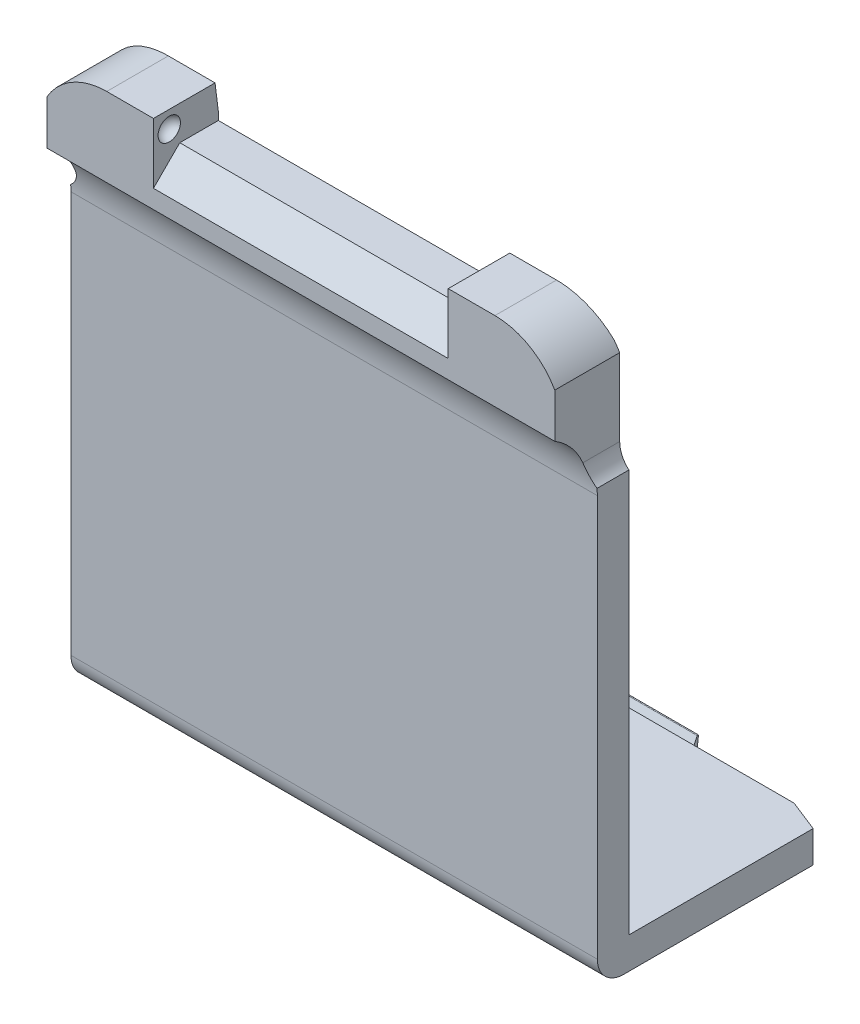
ISO-10303-21;
HEADER;
FILE_DESCRIPTION(('STEP AP214'),'2;1');
FILE_NAME('part.step','',(''),(''),'','','');
FILE_SCHEMA(('AUTOMOTIVE_DESIGN { 1 0 10303 214 1 1 1 1 }'));
ENDSEC;
DATA;
#1=APPLICATION_CONTEXT('core data for automotive mechanical design processes');
#2=APPLICATION_PROTOCOL_DEFINITION('international standard','automotive_design',2000,#1);
#3=PRODUCT_CONTEXT('',#1,'mechanical');
#4=PRODUCT('Part','Part','',(#3));
#5=PRODUCT_RELATED_PRODUCT_CATEGORY('part','',(#4));
#6=PRODUCT_DEFINITION_FORMATION('','',#4);
#7=PRODUCT_DEFINITION_CONTEXT('part definition',#1,'design');
#8=PRODUCT_DEFINITION('design','',#6,#7);
#9=PRODUCT_DEFINITION_SHAPE('','',#8);
#10=(LENGTH_UNIT() NAMED_UNIT(*) SI_UNIT(.MILLI.,.METRE.));
#11=(NAMED_UNIT(*) PLANE_ANGLE_UNIT() SI_UNIT($,.RADIAN.));
#12=(NAMED_UNIT(*) SI_UNIT($,.STERADIAN.) SOLID_ANGLE_UNIT());
#13=UNCERTAINTY_MEASURE_WITH_UNIT(LENGTH_MEASURE(1.E-05),#10,'distance_accuracy_value','');
#14=(GEOMETRIC_REPRESENTATION_CONTEXT(3) GLOBAL_UNCERTAINTY_ASSIGNED_CONTEXT((#13)) GLOBAL_UNIT_ASSIGNED_CONTEXT((#10,
#11,#12)) REPRESENTATION_CONTEXT('',''));
#15=CARTESIAN_POINT('',(0.,0.,0.));
#16=DIRECTION('',(0.,0.,1.));
#17=DIRECTION('',(1.,0.,0.));
#18=AXIS2_PLACEMENT_3D('',#15,#16,#17);
#19=CARTESIAN_POINT('',(0.,0.,-14.95));
#20=DIRECTION('',(0.,0.,1.));
#21=DIRECTION('',(1.,0.,0.));
#22=AXIS2_PLACEMENT_3D('',#19,#20,#21);
#23=PLANE('',#22);
#24=DIRECTION('',(0.,1.,0.));
#25=VECTOR('',#24,1.);
#26=CARTESIAN_POINT('',(10.,-2.4,-14.95));
#27=LINE('',#26,#25);
#28=CARTESIAN_POINT('',(10.,-2.4,-14.95));
#29=VERTEX_POINT('',#28);
#30=CARTESIAN_POINT('',(10.,0.,-14.95));
#31=VERTEX_POINT('',#30);
#32=EDGE_CURVE('E428',#29,#31,#27,.T.);
#33=ORIENTED_EDGE('',*,*,#32,.F.);
#34=DIRECTION('',(1.,0.,0.));
#35=VECTOR('',#34,1.);
#36=CARTESIAN_POINT('',(0.,-2.4,-14.95));
#37=LINE('',#36,#35);
#38=CARTESIAN_POINT('',(0.,-2.4,-14.95));
#39=VERTEX_POINT('',#38);
#40=EDGE_CURVE('E340',#39,#29,#37,.T.);
#41=ORIENTED_EDGE('',*,*,#40,.F.);
#42=DIRECTION('',(0.,-1.,0.));
#43=VECTOR('',#42,1.);
#44=CARTESIAN_POINT('',(0.,0.,-14.95));
#45=LINE('',#44,#43);
#46=CARTESIAN_POINT('',(0.,0.,-14.95));
#47=VERTEX_POINT('',#46);
#48=EDGE_CURVE('E351',#47,#39,#45,.T.);
#49=ORIENTED_EDGE('',*,*,#48,.F.);
#50=DIRECTION('',(-1.,0.,0.));
#51=VECTOR('',#50,1.);
#52=CARTESIAN_POINT('',(0.,0.,-14.95));
#53=LINE('',#52,#51);
#54=EDGE_CURVE('E335',#31,#47,#53,.T.);
#55=ORIENTED_EDGE('',*,*,#54,.F.);
#56=EDGE_LOOP('',(#33,#41,#49,#55));
#57=FACE_BOUND('',#56,.T.);
#58=ADVANCED_FACE('F35',(#57),#23,.F.);
#59=CARTESIAN_POINT('',(0.,40.6,2.4));
#60=DIRECTION('',(0.,-1.,0.));
#61=DIRECTION('',(0.,0.,-1.));
#62=AXIS2_PLACEMENT_3D('',#59,#60,#61);
#63=PLANE('',#62);
#64=DIRECTION('',(1.,0.,0.));
#65=VECTOR('',#64,1.);
#66=CARTESIAN_POINT('',(-7.60000000000001,40.6,0.25));
#67=LINE('',#66,#65);
#68=CARTESIAN_POINT('',(5.24999999999998,40.6,0.25));
#69=VERTEX_POINT('',#68);
#70=CARTESIAN_POINT('',(8.79999999999998,40.6,0.25));
#71=VERTEX_POINT('',#70);
#72=EDGE_CURVE('E380',#69,#71,#67,.T.);
#73=ORIENTED_EDGE('',*,*,#72,.F.);
#74=DIRECTION('',(0.,0.,-1.));
#75=VECTOR('',#74,1.);
#76=CARTESIAN_POINT('',(5.24999999999999,40.6,2.4));
#77=LINE('',#76,#75);
#78=CARTESIAN_POINT('',(5.24999999999999,40.6,4.93));
#79=VERTEX_POINT('',#78);
#80=EDGE_CURVE('E278',#69,#79,#77,.F.);
#81=ORIENTED_EDGE('',*,*,#80,.T.);
#82=DIRECTION('',(-1.,0.,0.));
#83=VECTOR('',#82,1.);
#84=CARTESIAN_POINT('',(0.,40.6,4.93));
#85=LINE('',#84,#83);
#86=CARTESIAN_POINT('',(8.79999999999999,40.6,4.93));
#87=VERTEX_POINT('',#86);
#88=EDGE_CURVE('E400',#87,#79,#85,.T.);
#89=ORIENTED_EDGE('',*,*,#88,.F.);
#90=DIRECTION('',(0.,0.,1.));
#91=VECTOR('',#90,1.);
#92=CARTESIAN_POINT('',(8.79999999999999,40.6,-22.5503880232691));
#93=LINE('',#92,#91);
#94=EDGE_CURVE('E410',#71,#87,#93,.T.);
#95=ORIENTED_EDGE('',*,*,#94,.F.);
#96=EDGE_LOOP('',(#73,#81,#89,#95));
#97=FACE_BOUND('',#96,.T.);
#98=ADVANCED_FACE('F462',(#97),#63,.F.);
#99=CARTESIAN_POINT('',(0.,0.,0.));
#100=DIRECTION('',(0.,0.,-1.));
#101=DIRECTION('',(-1.,0.,0.));
#102=AXIS2_PLACEMENT_3D('',#99,#100,#101);
#103=PLANE('',#102);
#104=DIRECTION('',(0.,-1.,0.));
#105=VECTOR('',#104,1.);
#106=CARTESIAN_POINT('',(0.,0.,0.));
#107=LINE('',#106,#105);
#108=CARTESIAN_POINT('',(0.,30.6,0.));
#109=VERTEX_POINT('',#108);
#110=CARTESIAN_POINT('',(0.,0.,0.));
#111=VERTEX_POINT('',#110);
#112=EDGE_CURVE('E235',#109,#111,#107,.T.);
#113=ORIENTED_EDGE('',*,*,#112,.F.);
#114=CARTESIAN_POINT('',(-1.30000000000002,32.1198684153571,0.));
#115=DIRECTION('',(0.,0.,-1.));
#116=DIRECTION('',(-1.,0.,0.));
#117=AXIS2_PLACEMENT_3D('',#114,#115,#116);
#118=CIRCLE('',#117,2.);
#119=CARTESIAN_POINT('',(0.699999999999978,32.1198684153571,0.));
#120=VERTEX_POINT('',#119);
#121=EDGE_CURVE('E218',#109,#120,#118,.F.);
#122=ORIENTED_EDGE('',*,*,#121,.T.);
#123=DIRECTION('',(0.,-1.,0.));
#124=VECTOR('',#123,1.);
#125=CARTESIAN_POINT('',(0.699999999999978,30.6,0.));
#126=LINE('',#125,#124);
#127=CARTESIAN_POINT('',(0.699999999999978,37.9691601707417,0.));
#128=VERTEX_POINT('',#127);
#129=EDGE_CURVE('E600',#128,#120,#126,.T.);
#130=ORIENTED_EDGE('',*,*,#129,.F.);
#131=CARTESIAN_POINT('',(5.24999999999999,35.35,0.));
#132=DIRECTION('',(0.,0.,-1.));
#133=DIRECTION('',(-1.,0.,0.));
#134=AXIS2_PLACEMENT_3D('',#131,#132,#133);
#135=CIRCLE('',#134,5.25);
#136=CARTESIAN_POINT('',(1.12689437438231,38.6,0.));
#137=VERTEX_POINT('',#136);
#138=EDGE_CURVE('E275',#128,#137,#135,.T.);
#139=ORIENTED_EDGE('',*,*,#138,.T.);
#140=DIRECTION('',(1.,0.,0.));
#141=VECTOR('',#140,1.);
#142=CARTESIAN_POINT('',(-7.60000000000001,38.6,0.));
#143=LINE('',#142,#141);
#144=CARTESIAN_POINT('',(8.79999999999999,38.6,0.));
#145=VERTEX_POINT('',#144);
#146=EDGE_CURVE('E379',#137,#145,#143,.T.);
#147=ORIENTED_EDGE('',*,*,#146,.T.);
#148=DIRECTION('',(0.,-1.,0.));
#149=VECTOR('',#148,1.);
#150=CARTESIAN_POINT('',(8.79999999999999,40.6,0.));
#151=LINE('',#150,#149);
#152=CARTESIAN_POINT('',(8.79999999999999,38.,0.));
#153=VERTEX_POINT('',#152);
#154=EDGE_CURVE('E407',#145,#153,#151,.T.);
#155=ORIENTED_EDGE('',*,*,#154,.T.);
#156=DIRECTION('',(1.,0.,0.));
#157=VECTOR('',#156,1.);
#158=CARTESIAN_POINT('',(8.79999999999999,38.,0.));
#159=LINE('',#158,#157);
#160=CARTESIAN_POINT('',(31.2,38.,0.));
#161=VERTEX_POINT('',#160);
#162=EDGE_CURVE('E403',#153,#161,#159,.T.);
#163=ORIENTED_EDGE('',*,*,#162,.T.);
#164=DIRECTION('',(0.,1.,0.));
#165=VECTOR('',#164,1.);
#166=CARTESIAN_POINT('',(31.2,40.6,0.));
#167=LINE('',#166,#165);
#168=CARTESIAN_POINT('',(31.2,38.6,0.));
#169=VERTEX_POINT('',#168);
#170=EDGE_CURVE('E411',#161,#169,#167,.T.);
#171=ORIENTED_EDGE('',*,*,#170,.T.);
#172=DIRECTION('',(-1.,0.,0.));
#173=VECTOR('',#172,1.);
#174=CARTESIAN_POINT('',(47.6,38.6,0.));
#175=LINE('',#174,#173);
#176=CARTESIAN_POINT('',(38.8731056256177,38.6,0.));
#177=VERTEX_POINT('',#176);
#178=EDGE_CURVE('E271',#177,#169,#175,.T.);
#179=ORIENTED_EDGE('',*,*,#178,.F.);
#180=CARTESIAN_POINT('',(34.75,35.35,0.));
#181=DIRECTION('',(0.,0.,-1.));
#182=DIRECTION('',(-1.,0.,0.));
#183=AXIS2_PLACEMENT_3D('',#180,#181,#182);
#184=CIRCLE('',#183,5.25);
#185=CARTESIAN_POINT('',(39.3,37.9691601707418,0.));
#186=VERTEX_POINT('',#185);
#187=EDGE_CURVE('E272',#177,#186,#184,.T.);
#188=ORIENTED_EDGE('',*,*,#187,.T.);
#189=DIRECTION('',(0.,1.,0.));
#190=VECTOR('',#189,1.);
#191=CARTESIAN_POINT('',(39.3,30.6,0.));
#192=LINE('',#191,#190);
#193=CARTESIAN_POINT('',(39.3,32.1198684153571,0.));
#194=VERTEX_POINT('',#193);
#195=EDGE_CURVE('E587',#194,#186,#192,.T.);
#196=ORIENTED_EDGE('',*,*,#195,.F.);
#197=CARTESIAN_POINT('',(41.3,32.1198684153571,0.));
#198=DIRECTION('',(0.,0.,-1.));
#199=DIRECTION('',(-1.,0.,0.));
#200=AXIS2_PLACEMENT_3D('',#197,#198,#199);
#201=CIRCLE('',#200,2.);
#202=CARTESIAN_POINT('',(40.,30.6,0.));
#203=VERTEX_POINT('',#202);
#204=EDGE_CURVE('E48',#194,#203,#201,.F.);
#205=ORIENTED_EDGE('',*,*,#204,.T.);
#206=DIRECTION('',(0.,1.,0.));
#207=VECTOR('',#206,1.);
#208=CARTESIAN_POINT('',(40.,0.,0.));
#209=LINE('',#208,#207);
#210=CARTESIAN_POINT('',(40.,0.,0.));
#211=VERTEX_POINT('',#210);
#212=EDGE_CURVE('E250',#211,#203,#209,.T.);
#213=ORIENTED_EDGE('',*,*,#212,.F.);
#214=DIRECTION('',(1.,0.,0.));
#215=VECTOR('',#214,1.);
#216=CARTESIAN_POINT('',(0.,0.,0.));
#217=LINE('',#216,#215);
#218=EDGE_CURVE('E246',#111,#211,#217,.T.);
#219=ORIENTED_EDGE('',*,*,#218,.F.);
#220=EDGE_LOOP('',(#113,#122,#130,#139,#147,#155,#163,#171,#179,#188,#196,#205,#213,#219));
#221=FACE_BOUND('',#220,.T.);
#222=ADVANCED_FACE('F243',(#221),#103,.T.);
#223=CARTESIAN_POINT('',(8.79999999999999,40.6,-22.5503880232691));
#224=DIRECTION('',(-1.,0.,0.));
#225=DIRECTION('',(0.,-1.,0.));
#226=AXIS2_PLACEMENT_3D('',#223,#224,#225);
#227=PLANE('',#226);
#228=CARTESIAN_POINT('',(8.79999999999999,39.3,3.73));
#229=DIRECTION('',(-1.,0.,0.));
#230=DIRECTION('',(0.,-1.,0.));
#231=AXIS2_PLACEMENT_3D('',#228,#229,#230);
#232=CIRCLE('',#231,0.85);
#233=CARTESIAN_POINT('',(8.79999999999999,38.45,3.73));
#234=VERTEX_POINT('',#233);
#235=EDGE_CURVE('E264',#234,#234,#232,.F.);
#236=ORIENTED_EDGE('',*,*,#235,.F.);
#237=EDGE_LOOP('',(#236));
#238=FACE_BOUND('',#237,.T.);
#239=DIRECTION('',(0.,0.992277876713668,0.124034734589208));
#240=VECTOR('',#239,1.);
#241=CARTESIAN_POINT('',(8.79999999999999,38.6,0.));
#242=LINE('',#241,#240);
#243=EDGE_CURVE('E376',#145,#71,#242,.T.);
#244=ORIENTED_EDGE('',*,*,#243,.T.);
#245=ORIENTED_EDGE('',*,*,#94,.T.);
#246=DIRECTION('',(0.,1.,0.));
#247=VECTOR('',#246,1.);
#248=CARTESIAN_POINT('',(8.80000000000002,0.,4.93));
#249=LINE('',#248,#247);
#250=CARTESIAN_POINT('',(8.8,36.,4.93));
#251=VERTEX_POINT('',#250);
#252=EDGE_CURVE('E397',#251,#87,#249,.T.);
#253=ORIENTED_EDGE('',*,*,#252,.F.);
#254=DIRECTION('',(0.,0.707106781186546,-0.707106781186549));
#255=VECTOR('',#254,1.);
#256=CARTESIAN_POINT('',(8.79999999999998,52.0401940116346,-11.1101940116346));
#257=LINE('',#256,#255);
#258=CARTESIAN_POINT('',(8.79999999999999,38.,2.92999999999999));
#259=VERTEX_POINT('',#258);
#260=EDGE_CURVE('E481',#251,#259,#257,.T.);
#261=ORIENTED_EDGE('',*,*,#260,.T.);
#262=DIRECTION('',(0.,0.,1.));
#263=VECTOR('',#262,1.);
#264=CARTESIAN_POINT('',(8.79999999999999,38.,-22.5503880232691));
#265=LINE('',#264,#263);
#266=EDGE_CURVE('E409',#153,#259,#265,.T.);
#267=ORIENTED_EDGE('',*,*,#266,.F.);
#268=ORIENTED_EDGE('',*,*,#154,.F.);
#269=EDGE_LOOP('',(#244,#245,#253,#261,#267,#268));
#270=FACE_BOUND('',#269,.T.);
#271=ADVANCED_FACE('F465',(#238,#270),#227,.F.);
#272=CARTESIAN_POINT('',(5.24999999999999,35.35,2.4));
#273=DIRECTION('',(0.,0.,-1.));
#274=DIRECTION('',(-1.,0.,0.));
#275=AXIS2_PLACEMENT_3D('',#272,#273,#274);
#276=CYLINDRICAL_SURFACE('',#275,5.25);
#277=DIRECTION('',(0.,0.,-1.));
#278=VECTOR('',#277,1.);
#279=CARTESIAN_POINT('',(0.699999999999978,37.9691601707417,2.4));
#280=LINE('',#279,#278);
#281=CARTESIAN_POINT('',(0.699999999999978,37.9691601707417,4.93));
#282=VERTEX_POINT('',#281);
#283=EDGE_CURVE('E240',#282,#128,#280,.T.);
#284=ORIENTED_EDGE('',*,*,#283,.F.);
#285=CARTESIAN_POINT('',(5.24999999999999,35.35,4.93));
#286=DIRECTION('',(0.,0.,1.));
#287=DIRECTION('',(1.,0.,0.));
#288=AXIS2_PLACEMENT_3D('',#285,#286,#287);
#289=CIRCLE('',#288,5.25);
#290=EDGE_CURVE('E282',#79,#282,#289,.T.);
#291=ORIENTED_EDGE('',*,*,#290,.F.);
#292=ORIENTED_EDGE('',*,*,#80,.F.);
#293=CARTESIAN_POINT('',(5.24999999999999,35.35,-0.406249999999997));
#294=DIRECTION('',(0.,0.124034734589208,-0.992277876713668));
#295=DIRECTION('',(0.,-0.992277876713668,-0.124034734589208));
#296=AXIS2_PLACEMENT_3D('',#293,#294,#295);
#297=ELLIPSE('',#296,5.29085664732092,5.25);
#298=EDGE_CURVE('E305',#69,#137,#297,.F.);
#299=ORIENTED_EDGE('',*,*,#298,.T.);
#300=ORIENTED_EDGE('',*,*,#138,.F.);
#301=EDGE_LOOP('',(#284,#291,#292,#299,#300));
#302=FACE_BOUND('',#301,.T.);
#303=ADVANCED_FACE('F454',(#302),#276,.T.);
#304=CARTESIAN_POINT('',(0.,0.,2.4));
#305=DIRECTION('',(0.,0.,-1.));
#306=DIRECTION('',(-1.,0.,0.));
#307=AXIS2_PLACEMENT_3D('',#304,#305,#306);
#308=PLANE('',#307);
#309=DIRECTION('',(0.,-1.,0.));
#310=VECTOR('',#309,1.);
#311=CARTESIAN_POINT('',(0.,0.,2.4));
#312=LINE('',#311,#310);
#313=CARTESIAN_POINT('',(0.,30.1095545877942,2.4));
#314=VERTEX_POINT('',#313);
#315=CARTESIAN_POINT('',(0.,-0.4,2.4));
#316=VERTEX_POINT('',#315);
#317=EDGE_CURVE('E289',#314,#316,#312,.T.);
#318=ORIENTED_EDGE('',*,*,#317,.T.);
#319=DIRECTION('',(1.,0.,0.));
#320=VECTOR('',#319,1.);
#321=CARTESIAN_POINT('',(40.,-0.4,2.4));
#322=LINE('',#321,#320);
#323=CARTESIAN_POINT('',(40.,-0.4,2.4));
#324=VERTEX_POINT('',#323);
#325=EDGE_CURVE('E307',#316,#324,#322,.T.);
#326=ORIENTED_EDGE('',*,*,#325,.T.);
#327=DIRECTION('',(0.,1.,0.));
#328=VECTOR('',#327,1.);
#329=CARTESIAN_POINT('',(40.,0.,2.4));
#330=LINE('',#329,#328);
#331=CARTESIAN_POINT('',(40.,30.1095545877942,2.4));
#332=VERTEX_POINT('',#331);
#333=EDGE_CURVE('E276',#324,#332,#330,.T.);
#334=ORIENTED_EDGE('',*,*,#333,.T.);
#335=DIRECTION('',(1.,0.,0.));
#336=VECTOR('',#335,1.);
#337=CARTESIAN_POINT('',(0.,30.1095545877942,2.4));
#338=LINE('',#337,#336);
#339=EDGE_CURVE('E288',#332,#314,#338,.F.);
#340=ORIENTED_EDGE('',*,*,#339,.T.);
#341=EDGE_LOOP('',(#318,#326,#334,#340));
#342=FACE_BOUND('',#341,.T.);
#343=ADVANCED_FACE('F439',(#342),#308,.F.);
#344=DIRECTION('',(0.,0.,-1.));
#345=VECTOR('',#344,1.);
#346=CARTESIAN_POINT('',(34.75,40.6,2.4));
#347=LINE('',#346,#345);
#348=CARTESIAN_POINT('',(34.75,40.6,4.93));
#349=VERTEX_POINT('',#348);
#350=CARTESIAN_POINT('',(34.75,40.6,0.25));
#351=VERTEX_POINT('',#350);
#352=EDGE_CURVE('E285',#349,#351,#347,.T.);
#353=ORIENTED_EDGE('',*,*,#352,.T.);
#354=DIRECTION('',(-1.,0.,0.));
#355=VECTOR('',#354,1.);
#356=CARTESIAN_POINT('',(47.6,40.6,0.25));
#357=LINE('',#356,#355);
#358=CARTESIAN_POINT('',(31.2,40.6,0.25));
#359=VERTEX_POINT('',#358);
#360=EDGE_CURVE('E386',#351,#359,#357,.T.);
#361=ORIENTED_EDGE('',*,*,#360,.T.);
#362=DIRECTION('',(0.,0.,1.));
#363=VECTOR('',#362,1.);
#364=CARTESIAN_POINT('',(31.2,40.6,-22.5503880232691));
#365=LINE('',#364,#363);
#366=CARTESIAN_POINT('',(31.2,40.6,4.93));
#367=VERTEX_POINT('',#366);
#368=EDGE_CURVE('E414',#359,#367,#365,.T.);
#369=ORIENTED_EDGE('',*,*,#368,.T.);
#370=DIRECTION('',(-1.,0.,0.));
#371=VECTOR('',#370,1.);
#372=CARTESIAN_POINT('',(0.,40.6,4.93));
#373=LINE('',#372,#371);
#374=EDGE_CURVE('E392',#349,#367,#373,.T.);
#375=ORIENTED_EDGE('',*,*,#374,.F.);
#376=EDGE_LOOP('',(#353,#361,#369,#375));
#377=FACE_BOUND('',#376,.T.);
#378=ADVANCED_FACE('F535',(#377),#63,.F.);
#379=CARTESIAN_POINT('',(0.,0.,2.4));
#380=DIRECTION('',(1.,0.,0.));
#381=DIRECTION('',(0.,1.,0.));
#382=AXIS2_PLACEMENT_3D('',#379,#380,#381);
#383=PLANE('',#382);
#384=CARTESIAN_POINT('',(0.,30.1095545877942,7.65));
#385=DIRECTION('',(1.,0.,0.));
#386=DIRECTION('',(0.,1.,0.));
#387=AXIS2_PLACEMENT_3D('',#384,#385,#386);
#388=CIRCLE('',#387,5.25);
#389=CARTESIAN_POINT('',(0.,30.6,2.4229584564836));
#390=VERTEX_POINT('',#389);
#391=EDGE_CURVE('E239',#314,#390,#388,.T.);
#392=ORIENTED_EDGE('',*,*,#391,.T.);
#393=DIRECTION('',(0.,0.,-1.));
#394=VECTOR('',#393,1.);
#395=CARTESIAN_POINT('',(0.,30.6,4.93));
#396=LINE('',#395,#394);
#397=EDGE_CURVE('E222',#390,#109,#396,.T.);
#398=ORIENTED_EDGE('',*,*,#397,.T.);
#399=ORIENTED_EDGE('',*,*,#112,.T.);
#400=DIRECTION('',(0.,0.,1.));
#401=VECTOR('',#400,1.);
#402=CARTESIAN_POINT('',(0.,0.,-14.95));
#403=LINE('',#402,#401);
#404=EDGE_CURVE('E248',#47,#111,#403,.T.);
#405=ORIENTED_EDGE('',*,*,#404,.F.);
#406=ORIENTED_EDGE('',*,*,#48,.T.);
#407=DIRECTION('',(0.,0.,1.));
#408=VECTOR('',#407,1.);
#409=CARTESIAN_POINT('',(0.,-2.4,-14.95));
#410=LINE('',#409,#408);
#411=CARTESIAN_POINT('',(0.,-2.4,0.399999999999999));
#412=VERTEX_POINT('',#411);
#413=EDGE_CURVE('E330',#39,#412,#410,.T.);
#414=ORIENTED_EDGE('',*,*,#413,.T.);
#415=CARTESIAN_POINT('',(0.,-0.4,0.4));
#416=DIRECTION('',(1.,0.,0.));
#417=DIRECTION('',(0.,1.,0.));
#418=AXIS2_PLACEMENT_3D('',#415,#416,#417);
#419=CIRCLE('',#418,2.);
#420=EDGE_CURVE('E315',#412,#316,#419,.F.);
#421=ORIENTED_EDGE('',*,*,#420,.T.);
#422=ORIENTED_EDGE('',*,*,#317,.F.);
#423=EDGE_LOOP('',(#392,#398,#399,#405,#406,#414,#421,#422));
#424=FACE_BOUND('',#423,.T.);
#425=ADVANCED_FACE('F233',(#424),#383,.F.);
#426=CARTESIAN_POINT('',(40.,0.,2.4));
#427=DIRECTION('',(-1.,0.,0.));
#428=DIRECTION('',(0.,-1.,0.));
#429=AXIS2_PLACEMENT_3D('',#426,#427,#428);
#430=PLANE('',#429);
#431=ORIENTED_EDGE('',*,*,#212,.T.);
#432=DIRECTION('',(0.,0.,-1.));
#433=VECTOR('',#432,1.);
#434=CARTESIAN_POINT('',(40.,30.6,4.93));
#435=LINE('',#434,#433);
#436=CARTESIAN_POINT('',(40.,30.6,2.4229584564836));
#437=VERTEX_POINT('',#436);
#438=EDGE_CURVE('E586',#437,#203,#435,.T.);
#439=ORIENTED_EDGE('',*,*,#438,.F.);
#440=CARTESIAN_POINT('',(40.,30.1095545877942,7.65));
#441=DIRECTION('',(-1.,0.,0.));
#442=DIRECTION('',(0.,-1.,0.));
#443=AXIS2_PLACEMENT_3D('',#440,#441,#442);
#444=CIRCLE('',#443,5.25);
#445=EDGE_CURVE('E442',#437,#332,#444,.T.);
#446=ORIENTED_EDGE('',*,*,#445,.T.);
#447=ORIENTED_EDGE('',*,*,#333,.F.);
#448=CARTESIAN_POINT('',(40.,-0.4,0.4));
#449=DIRECTION('',(-1.,0.,0.));
#450=DIRECTION('',(0.,-1.,0.));
#451=AXIS2_PLACEMENT_3D('',#448,#449,#450);
#452=CIRCLE('',#451,2.);
#453=CARTESIAN_POINT('',(40.,-2.4,0.399999999999999));
#454=VERTEX_POINT('',#453);
#455=EDGE_CURVE('E310',#324,#454,#452,.F.);
#456=ORIENTED_EDGE('',*,*,#455,.T.);
#457=DIRECTION('',(0.,0.,1.));
#458=VECTOR('',#457,1.);
#459=CARTESIAN_POINT('',(40.,-2.4,-14.95));
#460=LINE('',#459,#458);
#461=CARTESIAN_POINT('',(39.9999999997311,-2.4,-14.0000000004669));
#462=VERTEX_POINT('',#461);
#463=EDGE_CURVE('E323',#462,#454,#460,.T.);
#464=ORIENTED_EDGE('',*,*,#463,.F.);
#465=DIRECTION('',(0.,1.,0.));
#466=VECTOR('',#465,1.);
#467=CARTESIAN_POINT('',(39.9999999997311,-2.4,-14.0000000004669));
#468=LINE('',#467,#466);
#469=CARTESIAN_POINT('',(39.9999999997311,0.,-14.0000000004669));
#470=VERTEX_POINT('',#469);
#471=EDGE_CURVE('E370',#462,#470,#468,.T.);
#472=ORIENTED_EDGE('',*,*,#471,.T.);
#473=DIRECTION('',(0.,0.,1.));
#474=VECTOR('',#473,1.);
#475=CARTESIAN_POINT('',(40.,0.,-14.95));
#476=LINE('',#475,#474);
#477=EDGE_CURVE('E252',#470,#211,#476,.T.);
#478=ORIENTED_EDGE('',*,*,#477,.T.);
#479=EDGE_LOOP('',(#431,#439,#446,#447,#456,#464,#472,#478));
#480=FACE_BOUND('',#479,.T.);
#481=ADVANCED_FACE('F554',(#480),#430,.F.);
#482=CARTESIAN_POINT('',(0.,0.,-14.95));
#483=DIRECTION('',(0.,1.,0.));
#484=DIRECTION('',(0.,0.,1.));
#485=AXIS2_PLACEMENT_3D('',#482,#483,#484);
#486=PLANE('',#485);
#487=DIRECTION('',(0.929541286972721,0.,0.368718043785623));
#488=VECTOR('',#487,1.);
#489=CARTESIAN_POINT('',(37.5999999996896,0.,-14.9520000003623));
#490=LINE('',#489,#488);
#491=CARTESIAN_POINT('',(37.6050420174103,0.,-14.95));
#492=VERTEX_POINT('',#491);
#493=EDGE_CURVE('E371',#492,#470,#490,.T.);
#494=ORIENTED_EDGE('',*,*,#493,.F.);
#495=CARTESIAN_POINT('',(30.,0.,-14.95));
#496=VERTEX_POINT('',#495);
#497=EDGE_CURVE('E324',#492,#496,#53,.T.);
#498=ORIENTED_EDGE('',*,*,#497,.T.);
#499=DIRECTION('',(-1.,0.,0.));
#500=VECTOR('',#499,1.);
#501=CARTESIAN_POINT('',(30.,0.,-14.95));
#502=LINE('',#501,#500);
#503=EDGE_CURVE('E879',#496,#31,#502,.T.);
#504=ORIENTED_EDGE('',*,*,#503,.T.);
#505=ORIENTED_EDGE('',*,*,#54,.T.);
#506=ORIENTED_EDGE('',*,*,#404,.T.);
#507=ORIENTED_EDGE('',*,*,#218,.T.);
#508=ORIENTED_EDGE('',*,*,#477,.F.);
#509=EDGE_LOOP('',(#494,#498,#504,#505,#506,#507,#508));
#510=FACE_BOUND('',#509,.T.);
#511=ADVANCED_FACE('F547',(#510),#486,.T.);
#512=CARTESIAN_POINT('',(0.,-2.4,-14.95));
#513=DIRECTION('',(0.,-1.,0.));
#514=DIRECTION('',(0.,0.,-1.));
#515=AXIS2_PLACEMENT_3D('',#512,#513,#514);
#516=PLANE('',#515);
#517=DIRECTION('',(0.929541286972721,0.,0.368718043785623));
#518=VECTOR('',#517,1.);
#519=CARTESIAN_POINT('',(37.5999999996896,-2.4,-14.9520000003623));
#520=LINE('',#519,#518);
#521=CARTESIAN_POINT('',(37.6050420174103,-2.4,-14.95));
#522=VERTEX_POINT('',#521);
#523=EDGE_CURVE('E367',#522,#462,#520,.T.);
#524=ORIENTED_EDGE('',*,*,#523,.T.);
#525=ORIENTED_EDGE('',*,*,#463,.T.);
#526=DIRECTION('',(1.,0.,0.));
#527=VECTOR('',#526,1.);
#528=CARTESIAN_POINT('',(0.,-2.4,0.4));
#529=LINE('',#528,#527);
#530=EDGE_CURVE('E313',#454,#412,#529,.F.);
#531=ORIENTED_EDGE('',*,*,#530,.T.);
#532=ORIENTED_EDGE('',*,*,#413,.F.);
#533=ORIENTED_EDGE('',*,*,#40,.T.);
#534=DIRECTION('',(-1.,0.,0.));
#535=VECTOR('',#534,1.);
#536=CARTESIAN_POINT('',(30.,-2.39999999999999,-14.95));
#537=LINE('',#536,#535);
#538=CARTESIAN_POINT('',(30.,-2.39999999999999,-14.95));
#539=VERTEX_POINT('',#538);
#540=EDGE_CURVE('E373',#539,#29,#537,.T.);
#541=ORIENTED_EDGE('',*,*,#540,.F.);
#542=EDGE_CURVE('E343',#539,#522,#37,.T.);
#543=ORIENTED_EDGE('',*,*,#542,.T.);
#544=EDGE_LOOP('',(#524,#525,#531,#532,#533,#541,#543));
#545=FACE_BOUND('',#544,.T.);
#546=ADVANCED_FACE('F431',(#545),#516,.T.);
#547=ORIENTED_EDGE('',*,*,#542,.F.);
#548=DIRECTION('',(0.,1.,0.));
#549=VECTOR('',#548,1.);
#550=CARTESIAN_POINT('',(30.,-2.39999999999999,-14.95));
#551=LINE('',#550,#549);
#552=EDGE_CURVE('E355',#539,#496,#551,.T.);
#553=ORIENTED_EDGE('',*,*,#552,.T.);
#554=ORIENTED_EDGE('',*,*,#497,.F.);
#555=DIRECTION('',(0.,-1.,0.));
#556=VECTOR('',#555,1.);
#557=CARTESIAN_POINT('',(37.6050420174102,0.,-14.95));
#558=LINE('',#557,#556);
#559=EDGE_CURVE('E317',#492,#522,#558,.T.);
#560=ORIENTED_EDGE('',*,*,#559,.T.);
#561=EDGE_LOOP('',(#547,#553,#554,#560));
#562=FACE_BOUND('',#561,.T.);
#563=ADVANCED_FACE('F529',(#562),#23,.F.);
#564=CARTESIAN_POINT('',(8.79999999999999,38.,-22.5503880232691));
#565=DIRECTION('',(0.,-1.,0.));
#566=DIRECTION('',(0.,0.,-1.));
#567=AXIS2_PLACEMENT_3D('',#564,#565,#566);
#568=PLANE('',#567);
#569=ORIENTED_EDGE('',*,*,#266,.T.);
#570=DIRECTION('',(1.,0.,0.));
#571=VECTOR('',#570,1.);
#572=CARTESIAN_POINT('',(31.2,38.,2.92999999999999));
#573=LINE('',#572,#571);
#574=CARTESIAN_POINT('',(31.2,38.,2.92999999999999));
#575=VERTEX_POINT('',#574);
#576=EDGE_CURVE('E478',#259,#575,#573,.T.);
#577=ORIENTED_EDGE('',*,*,#576,.T.);
#578=DIRECTION('',(0.,0.,1.));
#579=VECTOR('',#578,1.);
#580=CARTESIAN_POINT('',(31.2,38.,-22.5503880232691));
#581=LINE('',#580,#579);
#582=EDGE_CURVE('E406',#161,#575,#581,.T.);
#583=ORIENTED_EDGE('',*,*,#582,.F.);
#584=ORIENTED_EDGE('',*,*,#162,.F.);
#585=EDGE_LOOP('',(#569,#577,#583,#584));
#586=FACE_BOUND('',#585,.T.);
#587=ADVANCED_FACE('F539',(#586),#568,.F.);
#588=CARTESIAN_POINT('',(31.2,40.6,-22.5503880232691));
#589=DIRECTION('',(1.,0.,0.));
#590=DIRECTION('',(0.,1.,0.));
#591=AXIS2_PLACEMENT_3D('',#588,#589,#590);
#592=PLANE('',#591);
#593=CARTESIAN_POINT('',(31.2,39.3,3.73));
#594=DIRECTION('',(1.,0.,0.));
#595=DIRECTION('',(0.,1.,0.));
#596=AXIS2_PLACEMENT_3D('',#593,#594,#595);
#597=CIRCLE('',#596,0.85);
#598=CARTESIAN_POINT('',(31.2,40.15,3.73));
#599=VERTEX_POINT('',#598);
#600=EDGE_CURVE('E268',#599,#599,#597,.F.);
#601=ORIENTED_EDGE('',*,*,#600,.F.);
#602=EDGE_LOOP('',(#601));
#603=FACE_BOUND('',#602,.T.);
#604=ORIENTED_EDGE('',*,*,#368,.F.);
#605=DIRECTION('',(0.,0.992277876713668,0.124034734589208));
#606=VECTOR('',#605,1.);
#607=CARTESIAN_POINT('',(31.2,38.6,0.));
#608=LINE('',#607,#606);
#609=EDGE_CURVE('E382',#169,#359,#608,.T.);
#610=ORIENTED_EDGE('',*,*,#609,.F.);
#611=ORIENTED_EDGE('',*,*,#170,.F.);
#612=ORIENTED_EDGE('',*,*,#582,.T.);
#613=DIRECTION('',(0.,-0.707106781186546,0.707106781186549));
#614=VECTOR('',#613,1.);
#615=CARTESIAN_POINT('',(31.2,52.0401940116346,-11.1101940116346));
#616=LINE('',#615,#614);
#617=CARTESIAN_POINT('',(31.2,36.,4.93));
#618=VERTEX_POINT('',#617);
#619=EDGE_CURVE('E488',#575,#618,#616,.T.);
#620=ORIENTED_EDGE('',*,*,#619,.T.);
#621=DIRECTION('',(0.,-1.,0.));
#622=VECTOR('',#621,1.);
#623=CARTESIAN_POINT('',(31.1999999999999,0.,4.93));
#624=LINE('',#623,#622);
#625=EDGE_CURVE('E395',#367,#618,#624,.T.);
#626=ORIENTED_EDGE('',*,*,#625,.F.);
#627=EDGE_LOOP('',(#604,#610,#611,#612,#620,#626));
#628=FACE_BOUND('',#627,.T.);
#629=ADVANCED_FACE('F546',(#603,#628),#592,.F.);
#630=CARTESIAN_POINT('',(0.,0.,4.93));
#631=DIRECTION('',(0.,0.,1.));
#632=DIRECTION('',(1.,0.,0.));
#633=AXIS2_PLACEMENT_3D('',#630,#631,#632);
#634=PLANE('',#633);
#635=DIRECTION('',(0.,-1.,0.));
#636=VECTOR('',#635,1.);
#637=CARTESIAN_POINT('',(0.699999999999978,30.6,4.93));
#638=LINE('',#637,#636);
#639=CARTESIAN_POINT('',(0.699999999999978,34.6,4.93));
#640=VERTEX_POINT('',#639);
#641=EDGE_CURVE('E241',#282,#640,#638,.T.);
#642=ORIENTED_EDGE('',*,*,#641,.T.);
#643=DIRECTION('',(1.,0.,0.));
#644=VECTOR('',#643,1.);
#645=CARTESIAN_POINT('',(0.,34.6,4.93));
#646=LINE('',#645,#644);
#647=CARTESIAN_POINT('',(39.3,34.6,4.93));
#648=VERTEX_POINT('',#647);
#649=EDGE_CURVE('E267',#640,#648,#646,.T.);
#650=ORIENTED_EDGE('',*,*,#649,.T.);
#651=DIRECTION('',(0.,1.,0.));
#652=VECTOR('',#651,1.);
#653=CARTESIAN_POINT('',(39.3,30.6,4.93));
#654=LINE('',#653,#652);
#655=CARTESIAN_POINT('',(39.3,37.9691601707418,4.93));
#656=VERTEX_POINT('',#655);
#657=EDGE_CURVE('E594',#648,#656,#654,.T.);
#658=ORIENTED_EDGE('',*,*,#657,.T.);
#659=CARTESIAN_POINT('',(34.75,35.35,4.93));
#660=DIRECTION('',(0.,0.,1.));
#661=DIRECTION('',(1.,0.,0.));
#662=AXIS2_PLACEMENT_3D('',#659,#660,#661);
#663=CIRCLE('',#662,5.25);
#664=EDGE_CURVE('E280',#656,#349,#663,.T.);
#665=ORIENTED_EDGE('',*,*,#664,.T.);
#666=ORIENTED_EDGE('',*,*,#374,.T.);
#667=ORIENTED_EDGE('',*,*,#625,.T.);
#668=DIRECTION('',(-1.,0.,0.));
#669=VECTOR('',#668,1.);
#670=CARTESIAN_POINT('',(8.79999999999999,36.,4.93));
#671=LINE('',#670,#669);
#672=EDGE_CURVE('E473',#618,#251,#671,.T.);
#673=ORIENTED_EDGE('',*,*,#672,.T.);
#674=ORIENTED_EDGE('',*,*,#252,.T.);
#675=ORIENTED_EDGE('',*,*,#88,.T.);
#676=ORIENTED_EDGE('',*,*,#290,.T.);
#677=EDGE_LOOP('',(#642,#650,#658,#665,#666,#667,#673,#674,#675,#676));
#678=FACE_BOUND('',#677,.T.);
#679=ADVANCED_FACE('F471',(#678),#634,.T.);
#680=CARTESIAN_POINT('',(8.79999999999999,39.3,3.73));
#681=DIRECTION('',(0.,0.,-1.));
#682=DIRECTION('',(0.,-1.,0.));
#683=AXIS2_PLACEMENT_3D('',#680,#681,#682);
#684=SPHERICAL_SURFACE('',#683,0.85);
#685=CARTESIAN_POINT('',(8.79999999999999,39.3,3.73));
#686=DIRECTION('',(-1.,0.,0.));
#687=DIRECTION('',(0.,-1.,0.));
#688=AXIS2_PLACEMENT_3D('',#685,#686,#687);
#689=SPHERICAL_SURFACE('',#688,0.85);
#690=ORIENTED_EDGE('',*,*,#235,.T.);
#691=EDGE_LOOP('',(#690));
#692=FACE_BOUND('',#691,.T.);
#693=ADVANCED_FACE('F576',(#692),#689,.F.);
#694=CARTESIAN_POINT('',(31.2,39.3,3.73));
#695=DIRECTION('',(0.,0.,-1.));
#696=DIRECTION('',(0.,-1.,0.));
#697=AXIS2_PLACEMENT_3D('',#694,#695,#696);
#698=SPHERICAL_SURFACE('',#697,0.85);
#699=CARTESIAN_POINT('',(31.2,39.3,3.73));
#700=DIRECTION('',(1.,0.,0.));
#701=DIRECTION('',(0.,1.,0.));
#702=AXIS2_PLACEMENT_3D('',#699,#700,#701);
#703=SPHERICAL_SURFACE('',#702,0.85);
#704=ORIENTED_EDGE('',*,*,#600,.T.);
#705=EDGE_LOOP('',(#704));
#706=FACE_BOUND('',#705,.T.);
#707=ADVANCED_FACE('F569',(#706),#703,.F.);
#708=CARTESIAN_POINT('',(34.75,35.35,2.4));
#709=DIRECTION('',(0.,0.,-1.));
#710=DIRECTION('',(-1.,0.,0.));
#711=AXIS2_PLACEMENT_3D('',#708,#709,#710);
#712=CYLINDRICAL_SURFACE('',#711,5.25);
#713=DIRECTION('',(0.,0.,-1.));
#714=VECTOR('',#713,1.);
#715=CARTESIAN_POINT('',(39.3,37.9691601707418,2.4));
#716=LINE('',#715,#714);
#717=EDGE_CURVE('E582',#186,#656,#716,.F.);
#718=ORIENTED_EDGE('',*,*,#717,.F.);
#719=ORIENTED_EDGE('',*,*,#187,.F.);
#720=CARTESIAN_POINT('',(34.75,35.35,-0.406249999999998));
#721=DIRECTION('',(0.,-0.124034734589208,0.992277876713668));
#722=DIRECTION('',(0.,-0.992277876713668,-0.124034734589208));
#723=AXIS2_PLACEMENT_3D('',#720,#721,#722);
#724=ELLIPSE('',#723,5.29085664732092,5.25);
#725=EDGE_CURVE('E444',#351,#177,#724,.F.);
#726=ORIENTED_EDGE('',*,*,#725,.F.);
#727=ORIENTED_EDGE('',*,*,#352,.F.);
#728=ORIENTED_EDGE('',*,*,#664,.F.);
#729=EDGE_LOOP('',(#718,#719,#726,#727,#728));
#730=FACE_BOUND('',#729,.T.);
#731=ADVANCED_FACE('F567',(#730),#712,.T.);
#732=CARTESIAN_POINT('',(0.,30.1095545877942,7.65));
#733=DIRECTION('',(1.,0.,0.));
#734=DIRECTION('',(0.,0.,-1.));
#735=AXIS2_PLACEMENT_3D('',#732,#733,#734);
#736=CYLINDRICAL_SURFACE('',#735,5.25);
#737=CARTESIAN_POINT('',(0.699999999999978,30.1095545877942,7.65));
#738=DIRECTION('',(1.,0.,0.));
#739=DIRECTION('',(0.,0.,-1.));
#740=AXIS2_PLACEMENT_3D('',#737,#738,#739);
#741=CIRCLE('',#740,5.25);
#742=CARTESIAN_POINT('',(0.699999999999978,32.1198684153571,2.8001403819585));
#743=VERTEX_POINT('',#742);
#744=EDGE_CURVE('E257',#640,#743,#741,.F.);
#745=ORIENTED_EDGE('',*,*,#744,.T.);
#746=CARTESIAN_POINT('',(0.699999999999978,32.1198684153571,2.8001403819585));
#747=CARTESIAN_POINT('',(0.700005655969038,32.0682037510504,2.77871685029372));
#748=CARTESIAN_POINT('',(0.697997798444316,32.0161828775433,2.75812910348081));
#749=CARTESIAN_POINT('',(0.689833230568136,31.911778902816,2.71871395281363));
#750=CARTESIAN_POINT('',(0.683674871998869,31.8593956658789,2.6998872516771));
#751=CARTESIAN_POINT('',(0.667086164540955,31.7546517594661,2.66409773821461));
#752=CARTESIAN_POINT('',(0.656655241242587,31.7022910939728,2.64713517689534));
#753=CARTESIAN_POINT('',(0.631471681540571,31.5980475086824,2.61513474028347));
#754=CARTESIAN_POINT('',(0.616719765350446,31.546164510754,2.60009654484157));
#755=CARTESIAN_POINT('',(0.565828519504925,31.3915514206969,2.55781316195063));
#756=CARTESIAN_POINT('',(0.523090346604419,31.2900953269662,2.53347952680049));
#757=CARTESIAN_POINT('',(0.420769529495453,31.0946328271189,2.49227624961955));
#758=CARTESIAN_POINT('',(0.361211945759132,31.0006156020904,2.47539559804579));
#759=CARTESIAN_POINT('',(0.250941822328478,30.8550819515754,2.45288358035165));
#760=CARTESIAN_POINT('',(0.204702330208922,30.8004045901847,2.44538862184));
#761=CARTESIAN_POINT('',(0.106505481049534,30.6961827595588,2.4326130326724));
#762=CARTESIAN_POINT('',(0.0545491804621458,30.6466373452265,2.42733199375419));
#763=CARTESIAN_POINT('',(0.,30.6,2.4229584564836));
#764=B_SPLINE_CURVE_WITH_KNOTS('',3,(#746,#747,#748,#749,#750,#751,#752,#753,#754,#755,#756,
#757,#758,#759,#760,#761,#762,#763),.UNSPECIFIED.,.F.,.F.,(4,2,2,2,2,2,2,2,4),(0.,
0.167760044728598,0.335586748431728,0.503436022406778,0.671257335541115,1.00765172797655,
1.3435475224997,1.55912868941561,1.7746700841488),.UNSPECIFIED.);
#765=EDGE_CURVE('E228',#743,#390,#764,.T.);
#766=ORIENTED_EDGE('',*,*,#765,.T.);
#767=ORIENTED_EDGE('',*,*,#391,.F.);
#768=ORIENTED_EDGE('',*,*,#339,.F.);
#769=ORIENTED_EDGE('',*,*,#445,.F.);
#770=CARTESIAN_POINT('',(40.,30.6,2.4229584564836));
#771=CARTESIAN_POINT('',(39.9587770192611,30.6352502492767,2.42626495031169));
#772=CARTESIAN_POINT('',(39.9190210876798,30.6721676018704,2.43008950045936));
#773=CARTESIAN_POINT('',(39.8426966672643,30.7490316831194,2.43894796602135));
#774=CARTESIAN_POINT('',(39.8061283485493,30.7889785732451,2.44398194592774));
#775=CARTESIAN_POINT('',(39.7365235325723,30.8714904356085,2.45541798239101));
#776=CARTESIAN_POINT('',(39.70347848543,30.9140486559697,2.46181660855679));
#777=CARTESIAN_POINT('',(39.6410401612422,31.0015020467585,2.47613310470071));
#778=CARTESIAN_POINT('',(39.6116466340271,31.0463970567909,2.48405087050632));
#779=CARTESIAN_POINT('',(39.5291465418922,31.1841784847039,2.51031220762332));
#780=CARTESIAN_POINT('',(39.4817627630976,31.2801108801131,2.53115729000235));
#781=CARTESIAN_POINT('',(39.4033053708813,31.4766285699698,2.58010222895789));
#782=CARTESIAN_POINT('',(39.3722318363452,31.577213886919,2.60820212062181));
#783=CARTESIAN_POINT('',(39.3326554605063,31.7520876295899,2.66296256521469));
#784=CARTESIAN_POINT('',(39.320309002504,31.8260703019832,2.68792749641002));
#785=CARTESIAN_POINT('',(39.3039761707283,31.9735624782982,2.7414164701038));
#786=CARTESIAN_POINT('',(39.2999784902757,32.047072487576,2.76993564354579));
#787=CARTESIAN_POINT('',(39.3,32.1198684153571,2.80014038195851));
#788=B_SPLINE_CURVE_WITH_KNOTS('',3,(#770,#771,#772,#773,#774,#775,#776,#777,#778,#779,#780,
#781,#782,#783,#784,#785,#786,#787),.UNSPECIFIED.,.F.,.F.,(4,2,2,2,2,2,2,2,4),(0.,
0.162972562314236,0.325953816965503,0.488530105939099,0.651095250488902,0.97642138314978,
1.30174908925866,1.53839571662226,1.77472164706346),.UNSPECIFIED.);
#789=CARTESIAN_POINT('',(39.3,32.1198684153571,2.80014038195851));
#790=VERTEX_POINT('',#789);
#791=EDGE_CURVE('E11',#437,#790,#788,.T.);
#792=ORIENTED_EDGE('',*,*,#791,.T.);
#793=CARTESIAN_POINT('',(39.3,30.1095545877942,7.65));
#794=DIRECTION('',(-1.,0.,0.));
#795=DIRECTION('',(0.,0.,1.));
#796=AXIS2_PLACEMENT_3D('',#793,#794,#795);
#797=CIRCLE('',#796,5.25);
#798=EDGE_CURVE('E489',#790,#648,#797,.F.);
#799=ORIENTED_EDGE('',*,*,#798,.T.);
#800=ORIENTED_EDGE('',*,*,#649,.F.);
#801=EDGE_LOOP('',(#745,#766,#767,#768,#769,#792,#799,#800));
#802=FACE_BOUND('',#801,.T.);
#803=ADVANCED_FACE('F499',(#802),#736,.F.);
#804=CARTESIAN_POINT('',(47.6,38.6,0.));
#805=DIRECTION('',(0.,-0.124034734589208,0.992277876713668));
#806=DIRECTION('',(0.,-0.992277876713668,-0.124034734589208));
#807=AXIS2_PLACEMENT_3D('',#804,#805,#806);
#808=PLANE('',#807);
#809=ORIENTED_EDGE('',*,*,#725,.T.);
#810=ORIENTED_EDGE('',*,*,#178,.T.);
#811=ORIENTED_EDGE('',*,*,#609,.T.);
#812=ORIENTED_EDGE('',*,*,#360,.F.);
#813=EDGE_LOOP('',(#809,#810,#811,#812));
#814=FACE_BOUND('',#813,.T.);
#815=ADVANCED_FACE('F525',(#814),#808,.F.);
#816=CARTESIAN_POINT('',(-7.60000000000001,38.6,0.));
#817=DIRECTION('',(0.,0.124034734589208,-0.992277876713668));
#818=DIRECTION('',(0.,0.992277876713668,0.124034734589208));
#819=AXIS2_PLACEMENT_3D('',#816,#817,#818);
#820=PLANE('',#819);
#821=ORIENTED_EDGE('',*,*,#72,.T.);
#822=ORIENTED_EDGE('',*,*,#243,.F.);
#823=ORIENTED_EDGE('',*,*,#146,.F.);
#824=ORIENTED_EDGE('',*,*,#298,.F.);
#825=EDGE_LOOP('',(#821,#822,#823,#824));
#826=FACE_BOUND('',#825,.T.);
#827=ADVANCED_FACE('F459',(#826),#820,.T.);
#828=CARTESIAN_POINT('',(0.,-0.4,0.4));
#829=DIRECTION('',(-1.,0.,0.));
#830=DIRECTION('',(0.,0.,1.));
#831=AXIS2_PLACEMENT_3D('',#828,#829,#830);
#832=CYLINDRICAL_SURFACE('',#831,2.);
#833=ORIENTED_EDGE('',*,*,#420,.F.);
#834=ORIENTED_EDGE('',*,*,#530,.F.);
#835=ORIENTED_EDGE('',*,*,#455,.F.);
#836=ORIENTED_EDGE('',*,*,#325,.F.);
#837=EDGE_LOOP('',(#833,#834,#835,#836));
#838=FACE_BOUND('',#837,.T.);
#839=ADVANCED_FACE('F436',(#838),#832,.T.);
#840=CARTESIAN_POINT('',(37.5999999996896,-2.4,-14.9520000003623));
#841=DIRECTION('',(-0.368718043785623,0.,0.929541286972721));
#842=DIRECTION('',(0.929541286972722,0.,0.368718043785623));
#843=AXIS2_PLACEMENT_3D('',#840,#841,#842);
#844=PLANE('',#843);
#845=ORIENTED_EDGE('',*,*,#493,.T.);
#846=ORIENTED_EDGE('',*,*,#471,.F.);
#847=ORIENTED_EDGE('',*,*,#523,.F.);
#848=ORIENTED_EDGE('',*,*,#559,.F.);
#849=EDGE_LOOP('',(#845,#846,#847,#848));
#850=FACE_BOUND('',#849,.T.);
#851=ADVANCED_FACE('F516',(#850),#844,.F.);
#852=CARTESIAN_POINT('',(30.,0.800000000000007,-15.323046126524));
#853=DIRECTION('',(0.,-0.115792747819703,-0.993273396176683));
#854=DIRECTION('',(0.,0.993273396176683,-0.115792747819703));
#855=AXIS2_PLACEMENT_3D('',#852,#853,#854);
#856=PLANE('',#855);
#857=DIRECTION('',(0.,-0.993273396176683,0.115792747819703));
#858=VECTOR('',#857,1.);
#859=CARTESIAN_POINT('',(10.,0.800000000000002,-15.323046126524));
#860=LINE('',#859,#858);
#861=CARTESIAN_POINT('',(10.,0.492528266464596,-15.2872020205206));
#862=VERTEX_POINT('',#861);
#863=EDGE_CURVE('E360',#862,#29,#860,.T.);
#864=ORIENTED_EDGE('',*,*,#863,.F.);
#865=DIRECTION('',(-1.,0.,0.));
#866=VECTOR('',#865,1.);
#867=CARTESIAN_POINT('',(30.,0.4925282664646,-15.2872020205206));
#868=LINE('',#867,#866);
#869=CARTESIAN_POINT('',(30.,0.4925282664646,-15.2872020205206));
#870=VERTEX_POINT('',#869);
#871=EDGE_CURVE('E483',#862,#870,#868,.F.);
#872=ORIENTED_EDGE('',*,*,#871,.T.);
#873=DIRECTION('',(0.,-0.993273396176683,0.115792747819703));
#874=VECTOR('',#873,1.);
#875=CARTESIAN_POINT('',(30.,0.800000000000007,-15.323046126524));
#876=LINE('',#875,#874);
#877=EDGE_CURVE('E880',#870,#539,#876,.T.);
#878=ORIENTED_EDGE('',*,*,#877,.T.);
#879=ORIENTED_EDGE('',*,*,#540,.T.);
#880=EDGE_LOOP('',(#864,#872,#878,#879));
#881=FACE_BOUND('',#880,.T.);
#882=ADVANCED_FACE('F522',(#881),#856,.T.);
#883=CARTESIAN_POINT('',(30.,0.,-14.95));
#884=DIRECTION('',(0.,0.4226182617407,0.906307787036649));
#885=DIRECTION('',(0.,-0.90630778703665,0.4226182617407));
#886=AXIS2_PLACEMENT_3D('',#883,#884,#885);
#887=PLANE('',#886);
#888=DIRECTION('',(0.,0.906307787036649,-0.4226182617407));
#889=VECTOR('',#888,1.);
#890=CARTESIAN_POINT('',(30.,0.,-14.95));
#891=LINE('',#890,#889);
#892=CARTESIAN_POINT('',(30.,0.51944881694262,-15.1922229613599));
#893=VERTEX_POINT('',#892);
#894=EDGE_CURVE('E359',#496,#893,#891,.T.);
#895=ORIENTED_EDGE('',*,*,#894,.T.);
#896=DIRECTION('',(-1.,0.,0.));
#897=VECTOR('',#896,1.);
#898=CARTESIAN_POINT('',(30.,0.51944881694262,-15.1922229613599));
#899=LINE('',#898,#897);
#900=CARTESIAN_POINT('',(10.,0.519448816942615,-15.1922229613599));
#901=VERTEX_POINT('',#900);
#902=EDGE_CURVE('E320',#893,#901,#899,.T.);
#903=ORIENTED_EDGE('',*,*,#902,.T.);
#904=DIRECTION('',(0.,0.906307787036649,-0.4226182617407));
#905=VECTOR('',#904,1.);
#906=CARTESIAN_POINT('',(10.,0.,-14.95));
#907=LINE('',#906,#905);
#908=EDGE_CURVE('E891',#31,#901,#907,.T.);
#909=ORIENTED_EDGE('',*,*,#908,.F.);
#910=ORIENTED_EDGE('',*,*,#503,.F.);
#911=EDGE_LOOP('',(#895,#903,#909,#910));
#912=FACE_BOUND('',#911,.T.);
#913=ADVANCED_FACE('F615',(#912),#887,.T.);
#914=CARTESIAN_POINT('',(30.,0.,0.));
#915=DIRECTION('',(-1.,0.,0.));
#916=DIRECTION('',(0.,0.,1.));
#917=AXIS2_PLACEMENT_3D('',#914,#915,#916);
#918=PLANE('',#917);
#919=ORIENTED_EDGE('',*,*,#877,.F.);
#920=CARTESIAN_POINT('',(30.,0.498317903855585,-15.2375383507117));
#921=DIRECTION('',(-1.,0.,0.));
#922=DIRECTION('',(0.,0.,1.));
#923=AXIS2_PLACEMENT_3D('',#920,#921,#922);
#924=CIRCLE('',#923,0.05);
#925=EDGE_CURVE('E479',#870,#893,#924,.F.);
#926=ORIENTED_EDGE('',*,*,#925,.T.);
#927=ORIENTED_EDGE('',*,*,#894,.F.);
#928=ORIENTED_EDGE('',*,*,#552,.F.);
#929=EDGE_LOOP('',(#919,#926,#927,#928));
#930=FACE_BOUND('',#929,.T.);
#931=ADVANCED_FACE('F611',(#930),#918,.F.);
#932=CARTESIAN_POINT('',(10.,0.,0.));
#933=DIRECTION('',(-1.,0.,0.));
#934=DIRECTION('',(0.,0.,1.));
#935=AXIS2_PLACEMENT_3D('',#932,#933,#934);
#936=PLANE('',#935);
#937=ORIENTED_EDGE('',*,*,#908,.T.);
#938=CARTESIAN_POINT('',(9.99999999999999,0.498317903855581,-15.2375383507117));
#939=DIRECTION('',(-1.,0.,0.));
#940=DIRECTION('',(0.,0.,1.));
#941=AXIS2_PLACEMENT_3D('',#938,#939,#940);
#942=CIRCLE('',#941,0.05);
#943=EDGE_CURVE('E883',#901,#862,#942,.T.);
#944=ORIENTED_EDGE('',*,*,#943,.T.);
#945=ORIENTED_EDGE('',*,*,#863,.T.);
#946=ORIENTED_EDGE('',*,*,#32,.T.);
#947=EDGE_LOOP('',(#937,#944,#945,#946));
#948=FACE_BOUND('',#947,.T.);
#949=ADVANCED_FACE('F513',(#948),#936,.T.);
#950=CARTESIAN_POINT('',(30.,0.498317903855585,-15.2375383507117));
#951=DIRECTION('',(-1.,0.,0.));
#952=DIRECTION('',(0.,0.,1.));
#953=AXIS2_PLACEMENT_3D('',#950,#951,#952);
#954=CYLINDRICAL_SURFACE('',#953,0.05);
#955=ORIENTED_EDGE('',*,*,#925,.F.);
#956=ORIENTED_EDGE('',*,*,#871,.F.);
#957=ORIENTED_EDGE('',*,*,#943,.F.);
#958=ORIENTED_EDGE('',*,*,#902,.F.);
#959=EDGE_LOOP('',(#955,#956,#957,#958));
#960=FACE_BOUND('',#959,.T.);
#961=ADVANCED_FACE('F511',(#960),#954,.T.);
#962=CARTESIAN_POINT('',(0.,36.,4.93));
#963=DIRECTION('',(0.,0.707106781186549,0.707106781186546));
#964=DIRECTION('',(1.,0.,0.));
#965=AXIS2_PLACEMENT_3D('',#962,#963,#964);
#966=PLANE('',#965);
#967=ORIENTED_EDGE('',*,*,#619,.F.);
#968=ORIENTED_EDGE('',*,*,#576,.F.);
#969=ORIENTED_EDGE('',*,*,#260,.F.);
#970=ORIENTED_EDGE('',*,*,#672,.F.);
#971=EDGE_LOOP('',(#967,#968,#969,#970));
#972=FACE_BOUND('',#971,.T.);
#973=ADVANCED_FACE('F507',(#972),#966,.T.);
#974=CARTESIAN_POINT('',(39.3,30.6,4.93));
#975=DIRECTION('',(-1.,0.,0.));
#976=DIRECTION('',(0.,0.,1.));
#977=AXIS2_PLACEMENT_3D('',#974,#975,#976);
#978=PLANE('',#977);
#979=ORIENTED_EDGE('',*,*,#798,.F.);
#980=DIRECTION('',(0.,0.,-1.));
#981=VECTOR('',#980,1.);
#982=CARTESIAN_POINT('',(39.3,32.1198684153571,4.93));
#983=LINE('',#982,#981);
#984=EDGE_CURVE('E229',#790,#194,#983,.T.);
#985=ORIENTED_EDGE('',*,*,#984,.T.);
#986=ORIENTED_EDGE('',*,*,#195,.T.);
#987=ORIENTED_EDGE('',*,*,#717,.T.);
#988=ORIENTED_EDGE('',*,*,#657,.F.);
#989=EDGE_LOOP('',(#979,#985,#986,#987,#988));
#990=FACE_BOUND('',#989,.T.);
#991=ADVANCED_FACE('F510',(#990),#978,.F.);
#992=CARTESIAN_POINT('',(0.699999999999978,30.6,4.93));
#993=DIRECTION('',(1.,0.,0.));
#994=DIRECTION('',(0.,0.,-1.));
#995=AXIS2_PLACEMENT_3D('',#992,#993,#994);
#996=PLANE('',#995);
#997=ORIENTED_EDGE('',*,*,#129,.T.);
#998=DIRECTION('',(0.,0.,1.));
#999=VECTOR('',#998,1.);
#1000=CARTESIAN_POINT('',(0.699999999999978,32.1198684153571,4.93));
#1001=LINE('',#1000,#999);
#1002=EDGE_CURVE('E223',#120,#743,#1001,.T.);
#1003=ORIENTED_EDGE('',*,*,#1002,.T.);
#1004=ORIENTED_EDGE('',*,*,#744,.F.);
#1005=ORIENTED_EDGE('',*,*,#641,.F.);
#1006=ORIENTED_EDGE('',*,*,#283,.T.);
#1007=EDGE_LOOP('',(#997,#1003,#1004,#1005,#1006));
#1008=FACE_BOUND('',#1007,.T.);
#1009=ADVANCED_FACE('F506',(#1008),#996,.F.);
#1010=CARTESIAN_POINT('',(-1.30000000000002,32.1198684153571,4.93));
#1011=DIRECTION('',(0.,0.,1.));
#1012=DIRECTION('',(1.,0.,0.));
#1013=AXIS2_PLACEMENT_3D('',#1010,#1011,#1012);
#1014=CYLINDRICAL_SURFACE('',#1013,2.);
#1015=ORIENTED_EDGE('',*,*,#765,.F.);
#1016=ORIENTED_EDGE('',*,*,#1002,.F.);
#1017=ORIENTED_EDGE('',*,*,#121,.F.);
#1018=ORIENTED_EDGE('',*,*,#397,.F.);
#1019=EDGE_LOOP('',(#1015,#1016,#1017,#1018));
#1020=FACE_BOUND('',#1019,.T.);
#1021=ADVANCED_FACE('F221',(#1020),#1014,.F.);
#1022=CARTESIAN_POINT('',(41.3,32.1198684153571,4.93));
#1023=DIRECTION('',(0.,0.,-1.));
#1024=DIRECTION('',(-1.,0.,0.));
#1025=AXIS2_PLACEMENT_3D('',#1022,#1023,#1024);
#1026=CYLINDRICAL_SURFACE('',#1025,2.);
#1027=ORIENTED_EDGE('',*,*,#791,.F.);
#1028=ORIENTED_EDGE('',*,*,#438,.T.);
#1029=ORIENTED_EDGE('',*,*,#204,.F.);
#1030=ORIENTED_EDGE('',*,*,#984,.F.);
#1031=EDGE_LOOP('',(#1027,#1028,#1029,#1030));
#1032=FACE_BOUND('',#1031,.T.);
#1033=ADVANCED_FACE('F37',(#1032),#1026,.F.);
#1034=CLOSED_SHELL('',(#58,#98,#222,#271,#303,#343,#378,#425,#481,#511,#546,#563,#587,#629,#679,
#693,#707,#731,#803,#815,#827,#839,#851,#882,#913,#931,#949,#961,#973,#991,#1009,#1021,#1033));
#1035=MANIFOLD_SOLID_BREP('B2',#1034);
#1036=ADVANCED_BREP_SHAPE_REPRESENTATION('',(#18,#1035),#14);
#1037=SHAPE_DEFINITION_REPRESENTATION(#9,#1036);
ENDSEC;
END-ISO-10303-21;
